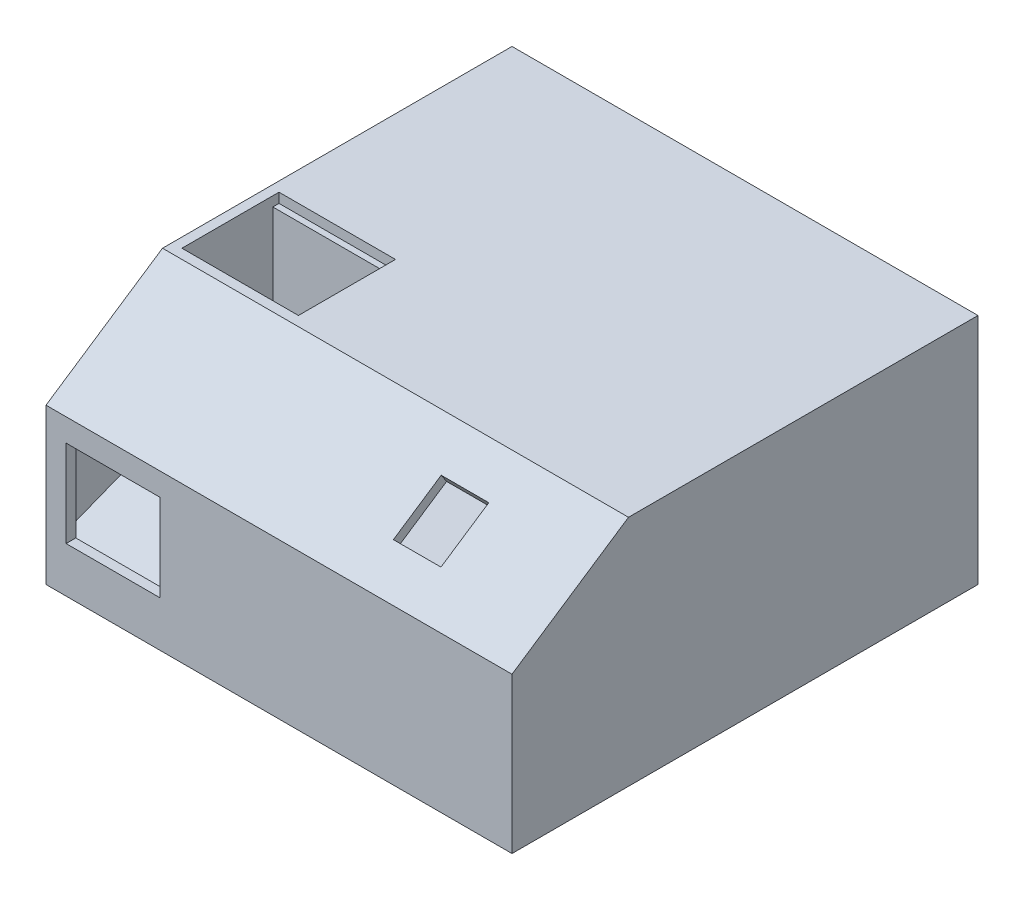
ISO-10303-21;
HEADER;
FILE_DESCRIPTION(('STEP AP214'),'2;1');
FILE_NAME('part.step','',(''),(''),'','','');
FILE_SCHEMA(('AUTOMOTIVE_DESIGN { 1 0 10303 214 1 1 1 1 }'));
ENDSEC;
DATA;
#1=APPLICATION_CONTEXT('core data for automotive mechanical design processes');
#2=APPLICATION_PROTOCOL_DEFINITION('international standard','automotive_design',2000,#1);
#3=PRODUCT_CONTEXT('',#1,'mechanical');
#4=PRODUCT('Part','Part','',(#3));
#5=PRODUCT_RELATED_PRODUCT_CATEGORY('part','',(#4));
#6=PRODUCT_DEFINITION_FORMATION('','',#4);
#7=PRODUCT_DEFINITION_CONTEXT('part definition',#1,'design');
#8=PRODUCT_DEFINITION('design','',#6,#7);
#9=PRODUCT_DEFINITION_SHAPE('','',#8);
#10=(LENGTH_UNIT() NAMED_UNIT(*) SI_UNIT(.MILLI.,.METRE.));
#11=(NAMED_UNIT(*) PLANE_ANGLE_UNIT() SI_UNIT($,.RADIAN.));
#12=(NAMED_UNIT(*) SI_UNIT($,.STERADIAN.) SOLID_ANGLE_UNIT());
#13=UNCERTAINTY_MEASURE_WITH_UNIT(LENGTH_MEASURE(1.E-05),#10,'distance_accuracy_value','');
#14=(GEOMETRIC_REPRESENTATION_CONTEXT(3) GLOBAL_UNCERTAINTY_ASSIGNED_CONTEXT((#13)) GLOBAL_UNIT_ASSIGNED_CONTEXT((#10,
#11,#12)) REPRESENTATION_CONTEXT('',''));
#15=CARTESIAN_POINT('',(0.,0.,0.));
#16=DIRECTION('',(0.,0.,1.));
#17=DIRECTION('',(1.,0.,0.));
#18=AXIS2_PLACEMENT_3D('',#15,#16,#17);
#19=CARTESIAN_POINT('',(-292.1,304.8,-304.8));
#20=DIRECTION('',(1.,0.,0.));
#21=DIRECTION('',(0.,0.,-1.));
#22=AXIS2_PLACEMENT_3D('',#19,#20,#21);
#23=PLANE('',#22);
#24=DIRECTION('',(0.,-1.,0.));
#25=VECTOR('',#24,1.);
#26=CARTESIAN_POINT('',(-292.1,304.8,292.1));
#27=LINE('',#26,#25);
#28=CARTESIAN_POINT('',(-292.1,196.403166267202,292.1));
#29=VERTEX_POINT('',#28);
#30=CARTESIAN_POINT('',(-292.1,59.5443169547873,292.1));
#31=VERTEX_POINT('',#30);
#32=EDGE_CURVE('E311',#29,#31,#27,.T.);
#33=ORIENTED_EDGE('',*,*,#32,.T.);
#34=DIRECTION('',(0.,-0.367891687131658,0.929868650154108));
#35=VECTOR('',#34,1.);
#36=CARTESIAN_POINT('',(-292.1,59.5443169547873,292.1));
#37=LINE('',#36,#35);
#38=CARTESIAN_POINT('',(-292.1,166.88227324806,20.7967767417733));
#39=VERTEX_POINT('',#38);
#40=EDGE_CURVE('E292',#39,#31,#37,.T.);
#41=ORIENTED_EDGE('',*,*,#40,.F.);
#42=DIRECTION('',(0.,-1.,0.));
#43=VECTOR('',#42,1.);
#44=CARTESIAN_POINT('',(-292.1,292.1,20.7967767417733));
#45=LINE('',#44,#43);
#46=CARTESIAN_POINT('',(-292.1,292.1,20.7967767417733));
#47=VERTEX_POINT('',#46);
#48=EDGE_CURVE('E346',#47,#39,#45,.T.);
#49=ORIENTED_EDGE('',*,*,#48,.F.);
#50=DIRECTION('',(0.,0.,-1.));
#51=VECTOR('',#50,1.);
#52=CARTESIAN_POINT('',(-292.1,292.1,148.554749400804));
#53=LINE('',#52,#51);
#54=CARTESIAN_POINT('',(-292.1,292.1,12.7));
#55=VERTEX_POINT('',#54);
#56=EDGE_CURVE('E352',#47,#55,#53,.T.);
#57=ORIENTED_EDGE('',*,*,#56,.T.);
#58=DIRECTION('',(0.,1.,0.));
#59=VECTOR('',#58,1.);
#60=CARTESIAN_POINT('',(-292.1,-0.000999999999973245,12.7));
#61=LINE('',#60,#59);
#62=CARTESIAN_POINT('',(-292.1,304.8,12.7));
#63=VERTEX_POINT('',#62);
#64=EDGE_CURVE('E380',#55,#63,#61,.T.);
#65=ORIENTED_EDGE('',*,*,#64,.T.);
#66=DIRECTION('',(0.,0.,1.));
#67=VECTOR('',#66,1.);
#68=CARTESIAN_POINT('',(-292.1,304.8,139.7));
#69=LINE('',#68,#67);
#70=CARTESIAN_POINT('',(-292.1,304.8,139.7));
#71=VERTEX_POINT('',#70);
#72=EDGE_CURVE('E381',#63,#71,#69,.T.);
#73=ORIENTED_EDGE('',*,*,#72,.T.);
#74=DIRECTION('',(0.,1.,0.));
#75=VECTOR('',#74,1.);
#76=CARTESIAN_POINT('',(-292.1,-0.000999999999973245,139.7));
#77=LINE('',#76,#75);
#78=CARTESIAN_POINT('',(-292.1,292.1,139.7));
#79=VERTEX_POINT('',#78);
#80=EDGE_CURVE('E400',#79,#71,#77,.T.);
#81=ORIENTED_EDGE('',*,*,#80,.F.);
#82=DIRECTION('',(0.,0.,1.));
#83=VECTOR('',#82,1.);
#84=CARTESIAN_POINT('',(-292.1,292.1,0.));
#85=LINE('',#84,#83);
#86=CARTESIAN_POINT('',(-292.1,292.1,148.554749400804));
#87=VERTEX_POINT('',#86);
#88=EDGE_CURVE('E323',#79,#87,#85,.T.);
#89=ORIENTED_EDGE('',*,*,#88,.T.);
#90=DIRECTION('',(0.,0.554700196225229,-0.832050294337844));
#91=VECTOR('',#90,1.);
#92=CARTESIAN_POINT('',(-292.1,192.632961261909,297.75530750794));
#93=LINE('',#92,#91);
#94=EDGE_CURVE('E319',#29,#87,#93,.T.);
#95=ORIENTED_EDGE('',*,*,#94,.F.);
#96=EDGE_LOOP('',(#33,#41,#49,#57,#65,#73,#81,#89,#95));
#97=FACE_BOUND('',#96,.T.);
#98=ADVANCED_FACE('F42',(#97),#23,.T.);
#99=CARTESIAN_POINT('',(-133.604,292.1,20.7967767417733));
#100=DIRECTION('',(0.,0.,-1.));
#101=DIRECTION('',(0.,1.,0.));
#102=AXIS2_PLACEMENT_3D('',#99,#100,#101);
#103=PLANE('',#102);
#104=DIRECTION('',(-1.,0.,0.));
#105=VECTOR('',#104,1.);
#106=CARTESIAN_POINT('',(304.802,166.88227324806,20.7967767417733));
#107=LINE('',#106,#105);
#108=CARTESIAN_POINT('',(-146.304,166.88227324806,20.7967767417733));
#109=VERTEX_POINT('',#108);
#110=EDGE_CURVE('E301',#109,#39,#107,.T.);
#111=ORIENTED_EDGE('',*,*,#110,.F.);
#112=DIRECTION('',(0.,-1.,0.));
#113=VECTOR('',#112,1.);
#114=CARTESIAN_POINT('',(-146.304,0.,20.7967767417733));
#115=LINE('',#114,#113);
#116=CARTESIAN_POINT('',(-146.304,292.1,20.7967767417733));
#117=VERTEX_POINT('',#116);
#118=EDGE_CURVE('E322',#117,#109,#115,.T.);
#119=ORIENTED_EDGE('',*,*,#118,.F.);
#120=DIRECTION('',(1.,0.,0.));
#121=VECTOR('',#120,1.);
#122=CARTESIAN_POINT('',(-133.604,292.1,20.7967767417733));
#123=LINE('',#122,#121);
#124=EDGE_CURVE('E349',#47,#117,#123,.T.);
#125=ORIENTED_EDGE('',*,*,#124,.F.);
#126=ORIENTED_EDGE('',*,*,#48,.T.);
#127=EDGE_LOOP('',(#111,#119,#125,#126));
#128=FACE_BOUND('',#127,.T.);
#129=ADVANCED_FACE('F546',(#128),#103,.F.);
#130=CARTESIAN_POINT('',(-146.304,0.,0.));
#131=DIRECTION('',(-1.,0.,0.));
#132=DIRECTION('',(0.,0.,1.));
#133=AXIS2_PLACEMENT_3D('',#130,#131,#132);
#134=PLANE('',#133);
#135=ORIENTED_EDGE('',*,*,#118,.T.);
#136=DIRECTION('',(0.,0.367891687131658,-0.929868650154108));
#137=VECTOR('',#136,1.);
#138=CARTESIAN_POINT('',(-146.304,59.5443169547873,292.1));
#139=LINE('',#138,#137);
#140=CARTESIAN_POINT('',(-146.303999999999,59.5443169547873,292.1));
#141=VERTEX_POINT('',#140);
#142=EDGE_CURVE('E289',#141,#109,#139,.T.);
#143=ORIENTED_EDGE('',*,*,#142,.F.);
#144=DIRECTION('',(0.,-1.,0.));
#145=VECTOR('',#144,1.);
#146=CARTESIAN_POINT('',(-146.304,0.,292.1));
#147=LINE('',#146,#145);
#148=CARTESIAN_POINT('',(-146.304,196.403166267202,292.1));
#149=VERTEX_POINT('',#148);
#150=EDGE_CURVE('E333',#149,#141,#147,.T.);
#151=ORIENTED_EDGE('',*,*,#150,.F.);
#152=DIRECTION('',(0.,0.554700196225229,-0.832050294337844));
#153=VECTOR('',#152,1.);
#154=CARTESIAN_POINT('',(-146.304,270.786807415756,180.52453827717));
#155=LINE('',#154,#153);
#156=CARTESIAN_POINT('',(-146.304,292.1,148.554749400804));
#157=VERTEX_POINT('',#156);
#158=EDGE_CURVE('E314',#149,#157,#155,.T.);
#159=ORIENTED_EDGE('',*,*,#158,.T.);
#160=DIRECTION('',(0.,0.,-1.));
#161=VECTOR('',#160,1.);
#162=CARTESIAN_POINT('',(-146.304,292.1,0.));
#163=LINE('',#162,#161);
#164=CARTESIAN_POINT('',(-146.304,292.1,139.7));
#165=VERTEX_POINT('',#164);
#166=EDGE_CURVE('E339',#157,#165,#163,.T.);
#167=ORIENTED_EDGE('',*,*,#166,.T.);
#168=EDGE_CURVE('E342',#165,#117,#163,.T.);
#169=ORIENTED_EDGE('',*,*,#168,.T.);
#170=EDGE_LOOP('',(#135,#143,#151,#159,#167,#169));
#171=FACE_BOUND('',#170,.T.);
#172=ADVANCED_FACE('F529',(#171),#134,.T.);
#173=CARTESIAN_POINT('',(-304.8,304.8,292.1));
#174=DIRECTION('',(0.,0.,-1.));
#175=DIRECTION('',(-1.,0.,0.));
#176=AXIS2_PLACEMENT_3D('',#173,#174,#175);
#177=PLANE('',#176);
#178=DIRECTION('',(0.,1.,0.));
#179=VECTOR('',#178,1.);
#180=CARTESIAN_POINT('',(-278.568540744124,59.5443169547873,292.1));
#181=LINE('',#180,#179);
#182=CARTESIAN_POINT('',(-278.568540744124,59.5443169547873,292.1));
#183=VERTEX_POINT('',#182);
#184=CARTESIAN_POINT('',(-278.568540744124,173.381452841056,292.1));
#185=VERTEX_POINT('',#184);
#186=EDGE_CURVE('E266',#183,#185,#181,.T.);
#187=ORIENTED_EDGE('',*,*,#186,.F.);
#188=DIRECTION('',(-1.,0.,0.));
#189=VECTOR('',#188,1.);
#190=CARTESIAN_POINT('',(304.802,59.5443169547873,292.1));
#191=LINE('',#190,#189);
#192=EDGE_CURVE('E300',#183,#31,#191,.T.);
#193=ORIENTED_EDGE('',*,*,#192,.T.);
#194=ORIENTED_EDGE('',*,*,#32,.F.);
#195=DIRECTION('',(-1.,0.,0.));
#196=VECTOR('',#195,1.);
#197=CARTESIAN_POINT('',(1447.8,196.403166267202,292.1));
#198=LINE('',#197,#196);
#199=EDGE_CURVE('E307',#149,#29,#198,.T.);
#200=ORIENTED_EDGE('',*,*,#199,.F.);
#201=ORIENTED_EDGE('',*,*,#150,.T.);
#202=CARTESIAN_POINT('',(-155.542107473219,59.5443169547873,292.1));
#203=VERTEX_POINT('',#202);
#204=EDGE_CURVE('E296',#141,#203,#191,.T.);
#205=ORIENTED_EDGE('',*,*,#204,.T.);
#206=DIRECTION('',(0.,-1.,0.));
#207=VECTOR('',#206,1.);
#208=CARTESIAN_POINT('',(-155.542107473219,59.5443169547873,292.1));
#209=LINE('',#208,#207);
#210=CARTESIAN_POINT('',(-155.542107473219,173.381452841056,292.1));
#211=VERTEX_POINT('',#210);
#212=EDGE_CURVE('E278',#211,#203,#209,.T.);
#213=ORIENTED_EDGE('',*,*,#212,.F.);
#214=DIRECTION('',(1.,0.,0.));
#215=VECTOR('',#214,1.);
#216=CARTESIAN_POINT('',(-278.568540744124,173.381452841056,292.1));
#217=LINE('',#216,#215);
#218=EDGE_CURVE('E58',#185,#211,#217,.T.);
#219=ORIENTED_EDGE('',*,*,#218,.F.);
#220=EDGE_LOOP('',(#187,#193,#194,#200,#201,#205,#213,#219));
#221=FACE_BOUND('',#220,.T.);
#222=ADVANCED_FACE('F275',(#221),#177,.T.);
#223=CARTESIAN_POINT('',(-133.604,292.1,148.554749400804));
#224=DIRECTION('',(0.,1.,0.));
#225=DIRECTION('',(0.,0.,1.));
#226=AXIS2_PLACEMENT_3D('',#223,#224,#225);
#227=PLANE('',#226);
#228=ORIENTED_EDGE('',*,*,#56,.F.);
#229=ORIENTED_EDGE('',*,*,#124,.T.);
#230=ORIENTED_EDGE('',*,*,#168,.F.);
#231=DIRECTION('',(1.,0.,0.));
#232=VECTOR('',#231,1.);
#233=CARTESIAN_POINT('',(-292.1,292.1,139.7));
#234=LINE('',#233,#232);
#235=CARTESIAN_POINT('',(-139.7,292.1,139.7));
#236=VERTEX_POINT('',#235);
#237=EDGE_CURVE('E374',#165,#236,#234,.T.);
#238=ORIENTED_EDGE('',*,*,#237,.T.);
#239=DIRECTION('',(0.,0.,-1.));
#240=VECTOR('',#239,1.);
#241=CARTESIAN_POINT('',(-139.7,292.1,139.7));
#242=LINE('',#241,#240);
#243=CARTESIAN_POINT('',(-139.7,292.1,12.7));
#244=VERTEX_POINT('',#243);
#245=EDGE_CURVE('E376',#236,#244,#242,.T.);
#246=ORIENTED_EDGE('',*,*,#245,.T.);
#247=DIRECTION('',(-1.,0.,0.));
#248=VECTOR('',#247,1.);
#249=CARTESIAN_POINT('',(-292.1,292.1,12.7));
#250=LINE('',#249,#248);
#251=EDGE_CURVE('E397',#244,#55,#250,.T.);
#252=ORIENTED_EDGE('',*,*,#251,.T.);
#253=EDGE_LOOP('',(#228,#229,#230,#238,#246,#252));
#254=FACE_BOUND('',#253,.T.);
#255=ADVANCED_FACE('F548',(#254),#227,.T.);
#256=CARTESIAN_POINT('',(-304.8,304.8,292.1));
#257=DIRECTION('',(0.,0.,-1.));
#258=DIRECTION('',(-1.,0.,0.));
#259=AXIS2_PLACEMENT_3D('',#256,#257,#258);
#260=PLANE('',#259);
#261=DIRECTION('',(1.,0.,0.));
#262=VECTOR('',#261,1.);
#263=CARTESIAN_POINT('',(0.,12.7,292.1));
#264=LINE('',#263,#262);
#265=CARTESIAN_POINT('',(-133.604,12.7,292.1));
#266=VERTEX_POINT('',#265);
#267=CARTESIAN_POINT('',(292.1,12.7,292.1));
#268=VERTEX_POINT('',#267);
#269=EDGE_CURVE('E440',#266,#268,#264,.T.);
#270=ORIENTED_EDGE('',*,*,#269,.F.);
#271=DIRECTION('',(0.,-1.,0.));
#272=VECTOR('',#271,1.);
#273=CARTESIAN_POINT('',(-133.604,196.403166267202,292.1));
#274=LINE('',#273,#272);
#275=CARTESIAN_POINT('',(-133.604,196.403166267202,292.1));
#276=VERTEX_POINT('',#275);
#277=EDGE_CURVE('E362',#276,#266,#274,.T.);
#278=ORIENTED_EDGE('',*,*,#277,.F.);
#279=DIRECTION('',(-1.,0.,0.));
#280=VECTOR('',#279,1.);
#281=CARTESIAN_POINT('',(1447.8,196.403166267202,292.1));
#282=LINE('',#281,#280);
#283=CARTESIAN_POINT('',(292.1,196.403166267202,292.1));
#284=VERTEX_POINT('',#283);
#285=EDGE_CURVE('E437',#284,#276,#282,.T.);
#286=ORIENTED_EDGE('',*,*,#285,.F.);
#287=DIRECTION('',(0.,-1.,0.));
#288=VECTOR('',#287,1.);
#289=CARTESIAN_POINT('',(292.1,304.8,292.1));
#290=LINE('',#289,#288);
#291=EDGE_CURVE('E443',#284,#268,#290,.T.);
#292=ORIENTED_EDGE('',*,*,#291,.T.);
#293=EDGE_LOOP('',(#270,#278,#286,#292));
#294=FACE_BOUND('',#293,.T.);
#295=ADVANCED_FACE('F630',(#294),#260,.T.);
#296=CARTESIAN_POINT('',(1447.8,192.632961261909,297.75530750794));
#297=DIRECTION('',(0.,0.832050294337844,0.554700196225229));
#298=DIRECTION('',(0.,-0.554700196225229,0.832050294337844));
#299=AXIS2_PLACEMENT_3D('',#296,#297,#298);
#300=PLANE('',#299);
#301=DIRECTION('',(0.,0.554700196225229,-0.832050294337844));
#302=VECTOR('',#301,1.);
#303=CARTESIAN_POINT('',(104.732083822483,264.285251038408,190.276872843191));
#304=LINE('',#303,#302);
#305=CARTESIAN_POINT('',(104.732083822483,222.580671485411,252.833742172688));
#306=VERTEX_POINT('',#305);
#307=CARTESIAN_POINT('',(104.732083822483,264.285251038408,190.276872843191));
#308=VERTEX_POINT('',#307);
#309=EDGE_CURVE('E407',#306,#308,#304,.T.);
#310=ORIENTED_EDGE('',*,*,#309,.F.);
#311=DIRECTION('',(-1.,0.,0.));
#312=VECTOR('',#311,1.);
#313=CARTESIAN_POINT('',(104.732083822483,222.580671485411,252.833742172688));
#314=LINE('',#313,#312);
#315=CARTESIAN_POINT('',(166.962083822483,222.580671485411,252.833742172688));
#316=VERTEX_POINT('',#315);
#317=EDGE_CURVE('E384',#316,#306,#314,.T.);
#318=ORIENTED_EDGE('',*,*,#317,.F.);
#319=DIRECTION('',(0.,-0.554700196225229,0.832050294337844));
#320=VECTOR('',#319,1.);
#321=CARTESIAN_POINT('',(166.962083822483,264.285251038408,190.276872843191));
#322=LINE('',#321,#320);
#323=CARTESIAN_POINT('',(166.962083822483,264.285251038408,190.276872843191));
#324=VERTEX_POINT('',#323);
#325=EDGE_CURVE('E420',#324,#316,#322,.T.);
#326=ORIENTED_EDGE('',*,*,#325,.F.);
#327=DIRECTION('',(1.,0.,0.));
#328=VECTOR('',#327,1.);
#329=CARTESIAN_POINT('',(104.732083822483,264.285251038408,190.276872843191));
#330=LINE('',#329,#328);
#331=EDGE_CURVE('E423',#308,#324,#330,.T.);
#332=ORIENTED_EDGE('',*,*,#331,.F.);
#333=EDGE_LOOP('',(#310,#318,#326,#332));
#334=FACE_BOUND('',#333,.T.);
#335=DIRECTION('',(0.,-0.554700196225229,0.832050294337843));
#336=VECTOR('',#335,1.);
#337=CARTESIAN_POINT('',(-133.604,292.1,148.554749400804));
#338=LINE('',#337,#336);
#339=CARTESIAN_POINT('',(-133.604,292.1,148.554749400804));
#340=VERTEX_POINT('',#339);
#341=EDGE_CURVE('E365',#340,#276,#338,.T.);
#342=ORIENTED_EDGE('',*,*,#341,.F.);
#343=DIRECTION('',(-1.,0.,0.));
#344=VECTOR('',#343,1.);
#345=CARTESIAN_POINT('',(0.,292.1,148.554749400804));
#346=LINE('',#345,#344);
#347=CARTESIAN_POINT('',(292.1,292.1,148.554749400804));
#348=VERTEX_POINT('',#347);
#349=EDGE_CURVE('E436',#348,#340,#346,.T.);
#350=ORIENTED_EDGE('',*,*,#349,.F.);
#351=DIRECTION('',(0.,0.554700196225229,-0.832050294337844));
#352=VECTOR('',#351,1.);
#353=CARTESIAN_POINT('',(292.1,192.632961261909,297.75530750794));
#354=LINE('',#353,#352);
#355=EDGE_CURVE('E439',#284,#348,#354,.T.);
#356=ORIENTED_EDGE('',*,*,#355,.F.);
#357=ORIENTED_EDGE('',*,*,#285,.T.);
#358=EDGE_LOOP('',(#342,#350,#356,#357));
#359=FACE_BOUND('',#358,.T.);
#360=ADVANCED_FACE('F635',(#334,#359),#300,.F.);
#361=CARTESIAN_POINT('',(-304.8,304.8,-304.8));
#362=DIRECTION('',(0.,0.,-1.));
#363=DIRECTION('',(-1.,0.,0.));
#364=AXIS2_PLACEMENT_3D('',#361,#362,#363);
#365=PLANE('',#364);
#366=DIRECTION('',(1.,0.,0.));
#367=VECTOR('',#366,1.);
#368=CARTESIAN_POINT('',(-304.8,0.,-304.8));
#369=LINE('',#368,#367);
#370=CARTESIAN_POINT('',(-304.8,0.,-304.8));
#371=VERTEX_POINT('',#370);
#372=CARTESIAN_POINT('',(304.8,0.,-304.8));
#373=VERTEX_POINT('',#372);
#374=EDGE_CURVE('E498',#371,#373,#369,.T.);
#375=ORIENTED_EDGE('',*,*,#374,.F.);
#376=DIRECTION('',(0.,-1.,0.));
#377=VECTOR('',#376,1.);
#378=CARTESIAN_POINT('',(-304.8,304.8,-304.8));
#379=LINE('',#378,#377);
#380=CARTESIAN_POINT('',(-304.8,304.8,-304.8));
#381=VERTEX_POINT('',#380);
#382=EDGE_CURVE('E504',#381,#371,#379,.T.);
#383=ORIENTED_EDGE('',*,*,#382,.F.);
#384=DIRECTION('',(1.,0.,0.));
#385=VECTOR('',#384,1.);
#386=CARTESIAN_POINT('',(-304.8,304.8,-304.8));
#387=LINE('',#386,#385);
#388=CARTESIAN_POINT('',(304.8,304.8,-304.8));
#389=VERTEX_POINT('',#388);
#390=EDGE_CURVE('E486',#381,#389,#387,.T.);
#391=ORIENTED_EDGE('',*,*,#390,.T.);
#392=DIRECTION('',(0.,-1.,0.));
#393=VECTOR('',#392,1.);
#394=CARTESIAN_POINT('',(304.8,304.8,-304.8));
#395=LINE('',#394,#393);
#396=EDGE_CURVE('E506',#389,#373,#395,.T.);
#397=ORIENTED_EDGE('',*,*,#396,.T.);
#398=EDGE_LOOP('',(#375,#383,#391,#397));
#399=FACE_BOUND('',#398,.T.);
#400=DIRECTION('',(0.,-1.,0.));
#401=VECTOR('',#400,1.);
#402=CARTESIAN_POINT('',(-292.1,304.8,-304.8));
#403=LINE('',#402,#401);
#404=CARTESIAN_POINT('',(-292.1,292.1,-304.8));
#405=VERTEX_POINT('',#404);
#406=CARTESIAN_POINT('',(-292.1,12.7,-304.8));
#407=VERTEX_POINT('',#406);
#408=EDGE_CURVE('E463',#405,#407,#403,.T.);
#409=ORIENTED_EDGE('',*,*,#408,.T.);
#410=DIRECTION('',(1.,0.,0.));
#411=VECTOR('',#410,1.);
#412=CARTESIAN_POINT('',(0.,12.7,-304.8));
#413=LINE('',#412,#411);
#414=CARTESIAN_POINT('',(292.1,12.7,-304.8));
#415=VERTEX_POINT('',#414);
#416=EDGE_CURVE('E457',#407,#415,#413,.T.);
#417=ORIENTED_EDGE('',*,*,#416,.T.);
#418=DIRECTION('',(0.,-1.,0.));
#419=VECTOR('',#418,1.);
#420=CARTESIAN_POINT('',(292.1,304.8,-304.8));
#421=LINE('',#420,#419);
#422=CARTESIAN_POINT('',(292.1,292.1,-304.8));
#423=VERTEX_POINT('',#422);
#424=EDGE_CURVE('E447',#423,#415,#421,.T.);
#425=ORIENTED_EDGE('',*,*,#424,.F.);
#426=DIRECTION('',(1.,0.,0.));
#427=VECTOR('',#426,1.);
#428=CARTESIAN_POINT('',(0.,292.1,-304.8));
#429=LINE('',#428,#427);
#430=EDGE_CURVE('E451',#405,#423,#429,.T.);
#431=ORIENTED_EDGE('',*,*,#430,.F.);
#432=EDGE_LOOP('',(#409,#417,#425,#431));
#433=FACE_BOUND('',#432,.T.);
#434=ADVANCED_FACE('F752',(#399,#433),#365,.T.);
#435=CARTESIAN_POINT('',(-304.8,304.8,304.8));
#436=DIRECTION('',(0.,0.,-1.));
#437=DIRECTION('',(-1.,0.,0.));
#438=AXIS2_PLACEMENT_3D('',#435,#436,#437);
#439=PLANE('',#438);
#440=DIRECTION('',(-1.,0.,0.));
#441=VECTOR('',#440,1.);
#442=CARTESIAN_POINT('',(-304.8,59.5443169547873,304.8));
#443=LINE('',#442,#441);
#444=CARTESIAN_POINT('',(-155.542107473219,59.5443169547873,304.8));
#445=VERTEX_POINT('',#444);
#446=CARTESIAN_POINT('',(-278.568540744124,59.5443169547873,304.8));
#447=VERTEX_POINT('',#446);
#448=EDGE_CURVE('E51',#445,#447,#443,.T.);
#449=ORIENTED_EDGE('',*,*,#448,.T.);
#450=DIRECTION('',(0.,1.,0.));
#451=VECTOR('',#450,1.);
#452=CARTESIAN_POINT('',(-278.568540744124,304.8,304.8));
#453=LINE('',#452,#451);
#454=CARTESIAN_POINT('',(-278.568540744124,173.381452841056,304.8));
#455=VERTEX_POINT('',#454);
#456=EDGE_CURVE('E11',#447,#455,#453,.T.);
#457=ORIENTED_EDGE('',*,*,#456,.T.);
#458=DIRECTION('',(1.,0.,0.));
#459=VECTOR('',#458,1.);
#460=CARTESIAN_POINT('',(-304.8,173.381452841056,304.8));
#461=LINE('',#460,#459);
#462=CARTESIAN_POINT('',(-155.542107473219,173.381452841056,304.8));
#463=VERTEX_POINT('',#462);
#464=EDGE_CURVE('E261',#455,#463,#461,.T.);
#465=ORIENTED_EDGE('',*,*,#464,.T.);
#466=DIRECTION('',(0.,-1.,0.));
#467=VECTOR('',#466,1.);
#468=CARTESIAN_POINT('',(-155.542107473219,304.8,304.8));
#469=LINE('',#468,#467);
#470=EDGE_CURVE('E511',#463,#445,#469,.T.);
#471=ORIENTED_EDGE('',*,*,#470,.T.);
#472=EDGE_LOOP('',(#449,#457,#465,#471));
#473=FACE_BOUND('',#472,.T.);
#474=DIRECTION('',(-1.,0.,0.));
#475=VECTOR('',#474,1.);
#476=CARTESIAN_POINT('',(1447.8,203.2,304.8));
#477=LINE('',#476,#475);
#478=CARTESIAN_POINT('',(304.8,203.2,304.8));
#479=VERTEX_POINT('',#478);
#480=CARTESIAN_POINT('',(-304.8,203.2,304.8));
#481=VERTEX_POINT('',#480);
#482=EDGE_CURVE('E477',#479,#481,#477,.T.);
#483=ORIENTED_EDGE('',*,*,#482,.T.);
#484=DIRECTION('',(0.,-1.,0.));
#485=VECTOR('',#484,1.);
#486=CARTESIAN_POINT('',(-304.8,304.8,304.8));
#487=LINE('',#486,#485);
#488=CARTESIAN_POINT('',(-304.8,0.,304.8));
#489=VERTEX_POINT('',#488);
#490=EDGE_CURVE('E492',#481,#489,#487,.T.);
#491=ORIENTED_EDGE('',*,*,#490,.T.);
#492=DIRECTION('',(1.,0.,0.));
#493=VECTOR('',#492,1.);
#494=CARTESIAN_POINT('',(-304.8,0.,304.8));
#495=LINE('',#494,#493);
#496=CARTESIAN_POINT('',(304.8,0.,304.8));
#497=VERTEX_POINT('',#496);
#498=EDGE_CURVE('E482',#489,#497,#495,.T.);
#499=ORIENTED_EDGE('',*,*,#498,.T.);
#500=DIRECTION('',(0.,-1.,0.));
#501=VECTOR('',#500,1.);
#502=CARTESIAN_POINT('',(304.8,304.8,304.8));
#503=LINE('',#502,#501);
#504=EDGE_CURVE('E508',#479,#497,#503,.T.);
#505=ORIENTED_EDGE('',*,*,#504,.F.);
#506=EDGE_LOOP('',(#483,#491,#499,#505));
#507=FACE_BOUND('',#506,.T.);
#508=ADVANCED_FACE('F44',(#473,#507),#439,.F.);
#509=CARTESIAN_POINT('',(304.8,304.8,-304.8));
#510=DIRECTION('',(1.,0.,0.));
#511=DIRECTION('',(0.,0.,-1.));
#512=AXIS2_PLACEMENT_3D('',#509,#510,#511);
#513=PLANE('',#512);
#514=DIRECTION('',(0.,0.,1.));
#515=VECTOR('',#514,1.);
#516=CARTESIAN_POINT('',(304.8,304.8,-304.8));
#517=LINE('',#516,#515);
#518=CARTESIAN_POINT('',(304.8,304.8,152.4));
#519=VERTEX_POINT('',#518);
#520=EDGE_CURVE('E483',#389,#519,#517,.T.);
#521=ORIENTED_EDGE('',*,*,#520,.T.);
#522=DIRECTION('',(0.,0.554700196225229,-0.832050294337844));
#523=VECTOR('',#522,1.);
#524=CARTESIAN_POINT('',(304.8,203.2,304.8));
#525=LINE('',#524,#523);
#526=EDGE_CURVE('E479',#479,#519,#525,.T.);
#527=ORIENTED_EDGE('',*,*,#526,.F.);
#528=ORIENTED_EDGE('',*,*,#504,.T.);
#529=DIRECTION('',(0.,0.,1.));
#530=VECTOR('',#529,1.);
#531=CARTESIAN_POINT('',(304.8,0.,-304.8));
#532=LINE('',#531,#530);
#533=EDGE_CURVE('E495',#373,#497,#532,.T.);
#534=ORIENTED_EDGE('',*,*,#533,.F.);
#535=ORIENTED_EDGE('',*,*,#396,.F.);
#536=EDGE_LOOP('',(#521,#527,#528,#534,#535));
#537=FACE_BOUND('',#536,.T.);
#538=ADVANCED_FACE('F751',(#537),#513,.T.);
#539=CARTESIAN_POINT('',(0.,304.8,0.));
#540=DIRECTION('',(0.,-1.,0.));
#541=DIRECTION('',(0.,0.,-1.));
#542=AXIS2_PLACEMENT_3D('',#539,#540,#541);
#543=PLANE('',#542);
#544=DIRECTION('',(0.,0.,-1.));
#545=VECTOR('',#544,1.);
#546=CARTESIAN_POINT('',(-139.7,304.8,139.7));
#547=LINE('',#546,#545);
#548=CARTESIAN_POINT('',(-139.7,304.8,139.7));
#549=VERTEX_POINT('',#548);
#550=CARTESIAN_POINT('',(-139.7,304.8,12.7));
#551=VERTEX_POINT('',#550);
#552=EDGE_CURVE('E388',#549,#551,#547,.T.);
#553=ORIENTED_EDGE('',*,*,#552,.F.);
#554=DIRECTION('',(1.,0.,0.));
#555=VECTOR('',#554,1.);
#556=CARTESIAN_POINT('',(-292.1,304.8,139.7));
#557=LINE('',#556,#555);
#558=EDGE_CURVE('E391',#71,#549,#557,.T.);
#559=ORIENTED_EDGE('',*,*,#558,.F.);
#560=ORIENTED_EDGE('',*,*,#72,.F.);
#561=DIRECTION('',(-1.,0.,0.));
#562=VECTOR('',#561,1.);
#563=CARTESIAN_POINT('',(-292.1,304.8,12.7));
#564=LINE('',#563,#562);
#565=EDGE_CURVE('E385',#551,#63,#564,.T.);
#566=ORIENTED_EDGE('',*,*,#565,.F.);
#567=EDGE_LOOP('',(#553,#559,#560,#566));
#568=FACE_BOUND('',#567,.T.);
#569=DIRECTION('',(-1.,0.,0.));
#570=VECTOR('',#569,1.);
#571=CARTESIAN_POINT('',(1447.8,304.8,152.4));
#572=LINE('',#571,#570);
#573=CARTESIAN_POINT('',(-304.8,304.8,152.4));
#574=VERTEX_POINT('',#573);
#575=EDGE_CURVE('E474',#519,#574,#572,.T.);
#576=ORIENTED_EDGE('',*,*,#575,.F.);
#577=ORIENTED_EDGE('',*,*,#520,.F.);
#578=ORIENTED_EDGE('',*,*,#390,.F.);
#579=DIRECTION('',(0.,0.,1.));
#580=VECTOR('',#579,1.);
#581=CARTESIAN_POINT('',(-304.8,304.8,-304.8));
#582=LINE('',#581,#580);
#583=EDGE_CURVE('E490',#381,#574,#582,.T.);
#584=ORIENTED_EDGE('',*,*,#583,.T.);
#585=EDGE_LOOP('',(#576,#577,#578,#584));
#586=FACE_BOUND('',#585,.T.);
#587=ADVANCED_FACE('F560',(#568,#586),#543,.F.);
#588=CARTESIAN_POINT('',(-304.8,304.8,-304.8));
#589=DIRECTION('',(1.,0.,0.));
#590=DIRECTION('',(0.,0.,-1.));
#591=AXIS2_PLACEMENT_3D('',#588,#589,#590);
#592=PLANE('',#591);
#593=ORIENTED_EDGE('',*,*,#490,.F.);
#594=DIRECTION('',(0.,0.554700196225229,-0.832050294337844));
#595=VECTOR('',#594,1.);
#596=CARTESIAN_POINT('',(-304.8,203.2,304.8));
#597=LINE('',#596,#595);
#598=EDGE_CURVE('E446',#481,#574,#597,.T.);
#599=ORIENTED_EDGE('',*,*,#598,.T.);
#600=ORIENTED_EDGE('',*,*,#583,.F.);
#601=ORIENTED_EDGE('',*,*,#382,.T.);
#602=DIRECTION('',(0.,0.,1.));
#603=VECTOR('',#602,1.);
#604=CARTESIAN_POINT('',(-304.8,0.,-304.8));
#605=LINE('',#604,#603);
#606=EDGE_CURVE('E487',#371,#489,#605,.T.);
#607=ORIENTED_EDGE('',*,*,#606,.T.);
#608=EDGE_LOOP('',(#593,#599,#600,#601,#607));
#609=FACE_BOUND('',#608,.T.);
#610=ADVANCED_FACE('F774',(#609),#592,.F.);
#611=CARTESIAN_POINT('',(0.,0.,0.));
#612=DIRECTION('',(0.,-1.,0.));
#613=DIRECTION('',(0.,0.,-1.));
#614=AXIS2_PLACEMENT_3D('',#611,#612,#613);
#615=PLANE('',#614);
#616=ORIENTED_EDGE('',*,*,#498,.F.);
#617=ORIENTED_EDGE('',*,*,#606,.F.);
#618=ORIENTED_EDGE('',*,*,#374,.T.);
#619=ORIENTED_EDGE('',*,*,#533,.T.);
#620=EDGE_LOOP('',(#616,#617,#618,#619));
#621=FACE_BOUND('',#620,.T.);
#622=ADVANCED_FACE('F783',(#621),#615,.T.);
#623=CARTESIAN_POINT('',(1447.8,203.2,304.8));
#624=DIRECTION('',(0.,0.832050294337844,0.554700196225229));
#625=DIRECTION('',(0.,-0.554700196225229,0.832050294337844));
#626=AXIS2_PLACEMENT_3D('',#623,#624,#625);
#627=PLANE('',#626);
#628=DIRECTION('',(1.,0.,0.));
#629=VECTOR('',#628,1.);
#630=CARTESIAN_POINT('',(104.732083822483,233.147710223501,259.878434664748));
#631=LINE('',#630,#629);
#632=CARTESIAN_POINT('',(104.732083822483,233.147710223501,259.878434664748));
#633=VERTEX_POINT('',#632);
#634=CARTESIAN_POINT('',(166.962083822483,233.147710223501,259.878434664748));
#635=VERTEX_POINT('',#634);
#636=EDGE_CURVE('E414',#633,#635,#631,.T.);
#637=ORIENTED_EDGE('',*,*,#636,.F.);
#638=DIRECTION('',(0.,-0.554700196225229,0.832050294337844));
#639=VECTOR('',#638,1.);
#640=CARTESIAN_POINT('',(104.732083822483,274.852289776499,197.321565335252));
#641=LINE('',#640,#639);
#642=CARTESIAN_POINT('',(104.732083822483,274.852289776499,197.321565335252));
#643=VERTEX_POINT('',#642);
#644=EDGE_CURVE('E417',#643,#633,#641,.T.);
#645=ORIENTED_EDGE('',*,*,#644,.F.);
#646=DIRECTION('',(-1.,0.,0.));
#647=VECTOR('',#646,1.);
#648=CARTESIAN_POINT('',(104.732083822483,274.852289776499,197.321565335252));
#649=LINE('',#648,#647);
#650=CARTESIAN_POINT('',(166.962083822483,274.852289776499,197.321565335252));
#651=VERTEX_POINT('',#650);
#652=EDGE_CURVE('E408',#651,#643,#649,.T.);
#653=ORIENTED_EDGE('',*,*,#652,.F.);
#654=DIRECTION('',(0.,0.554700196225229,-0.832050294337843));
#655=VECTOR('',#654,1.);
#656=CARTESIAN_POINT('',(166.962083822483,274.852289776499,197.321565335252));
#657=LINE('',#656,#655);
#658=EDGE_CURVE('E411',#635,#651,#657,.T.);
#659=ORIENTED_EDGE('',*,*,#658,.F.);
#660=EDGE_LOOP('',(#637,#645,#653,#659));
#661=FACE_BOUND('',#660,.T.);
#662=ORIENTED_EDGE('',*,*,#482,.F.);
#663=ORIENTED_EDGE('',*,*,#526,.T.);
#664=ORIENTED_EDGE('',*,*,#575,.T.);
#665=ORIENTED_EDGE('',*,*,#598,.F.);
#666=EDGE_LOOP('',(#662,#663,#664,#665));
#667=FACE_BOUND('',#666,.T.);
#668=ADVANCED_FACE('F790',(#661,#667),#627,.T.);
#669=CARTESIAN_POINT('',(292.1,304.8,-304.8));
#670=DIRECTION('',(1.,0.,0.));
#671=DIRECTION('',(0.,0.,-1.));
#672=AXIS2_PLACEMENT_3D('',#669,#670,#671);
#673=PLANE('',#672);
#674=DIRECTION('',(0.,0.,1.));
#675=VECTOR('',#674,1.);
#676=CARTESIAN_POINT('',(292.1,292.1,0.));
#677=LINE('',#676,#675);
#678=EDGE_CURVE('E448',#423,#348,#677,.T.);
#679=ORIENTED_EDGE('',*,*,#678,.F.);
#680=ORIENTED_EDGE('',*,*,#424,.T.);
#681=DIRECTION('',(0.,0.,1.));
#682=VECTOR('',#681,1.);
#683=CARTESIAN_POINT('',(292.1,12.7,0.));
#684=LINE('',#683,#682);
#685=EDGE_CURVE('E442',#415,#268,#684,.T.);
#686=ORIENTED_EDGE('',*,*,#685,.T.);
#687=ORIENTED_EDGE('',*,*,#291,.F.);
#688=ORIENTED_EDGE('',*,*,#355,.T.);
#689=EDGE_LOOP('',(#679,#680,#686,#687,#688));
#690=FACE_BOUND('',#689,.T.);
#691=ADVANCED_FACE('F797',(#690),#673,.F.);
#692=CARTESIAN_POINT('',(0.,292.1,0.));
#693=DIRECTION('',(0.,-1.,0.));
#694=DIRECTION('',(0.,0.,-1.));
#695=AXIS2_PLACEMENT_3D('',#692,#693,#694);
#696=PLANE('',#695);
#697=DIRECTION('',(-1.,0.,0.));
#698=VECTOR('',#697,1.);
#699=CARTESIAN_POINT('',(-133.604,292.1,8.09677674177331));
#700=LINE('',#699,#698);
#701=CARTESIAN_POINT('',(-133.604,292.1,8.09677674177327));
#702=VERTEX_POINT('',#701);
#703=CARTESIAN_POINT('',(-292.1,292.1,8.09677674177326));
#704=VERTEX_POINT('',#703);
#705=EDGE_CURVE('E368',#702,#704,#700,.T.);
#706=ORIENTED_EDGE('',*,*,#705,.T.);
#707=DIRECTION('',(0.,0.,1.));
#708=VECTOR('',#707,1.);
#709=CARTESIAN_POINT('',(-292.1,292.1,0.));
#710=LINE('',#709,#708);
#711=EDGE_CURVE('E460',#405,#704,#710,.T.);
#712=ORIENTED_EDGE('',*,*,#711,.F.);
#713=ORIENTED_EDGE('',*,*,#430,.T.);
#714=ORIENTED_EDGE('',*,*,#678,.T.);
#715=ORIENTED_EDGE('',*,*,#349,.T.);
#716=DIRECTION('',(0.,0.,-1.));
#717=VECTOR('',#716,1.);
#718=CARTESIAN_POINT('',(-133.604,292.1,148.554749400804));
#719=LINE('',#718,#717);
#720=EDGE_CURVE('E353',#340,#702,#719,.T.);
#721=ORIENTED_EDGE('',*,*,#720,.T.);
#722=EDGE_LOOP('',(#706,#712,#713,#714,#715,#721));
#723=FACE_BOUND('',#722,.T.);
#724=ADVANCED_FACE('F594',(#723),#696,.T.);
#725=DIRECTION('',(0.,-1.,0.));
#726=VECTOR('',#725,1.);
#727=CARTESIAN_POINT('',(-292.1,292.1,8.09677674177331));
#728=LINE('',#727,#726);
#729=CARTESIAN_POINT('',(-292.1,12.7,8.09677674177327));
#730=VERTEX_POINT('',#729);
#731=EDGE_CURVE('E356',#704,#730,#728,.T.);
#732=ORIENTED_EDGE('',*,*,#731,.T.);
#733=DIRECTION('',(0.,0.,1.));
#734=VECTOR('',#733,1.);
#735=CARTESIAN_POINT('',(-292.1,12.7,0.));
#736=LINE('',#735,#734);
#737=EDGE_CURVE('E452',#407,#730,#736,.T.);
#738=ORIENTED_EDGE('',*,*,#737,.F.);
#739=ORIENTED_EDGE('',*,*,#408,.F.);
#740=ORIENTED_EDGE('',*,*,#711,.T.);
#741=EDGE_LOOP('',(#732,#738,#739,#740));
#742=FACE_BOUND('',#741,.T.);
#743=ADVANCED_FACE('F582',(#742),#23,.T.);
#744=CARTESIAN_POINT('',(0.,12.7,0.));
#745=DIRECTION('',(0.,-1.,0.));
#746=DIRECTION('',(0.,0.,-1.));
#747=AXIS2_PLACEMENT_3D('',#744,#745,#746);
#748=PLANE('',#747);
#749=ORIENTED_EDGE('',*,*,#737,.T.);
#750=DIRECTION('',(-1.,0.,0.));
#751=VECTOR('',#750,1.);
#752=CARTESIAN_POINT('',(-133.604,12.7,8.09677674177327));
#753=LINE('',#752,#751);
#754=CARTESIAN_POINT('',(-133.604,12.7,8.09677674177327));
#755=VERTEX_POINT('',#754);
#756=EDGE_CURVE('E371',#755,#730,#753,.T.);
#757=ORIENTED_EDGE('',*,*,#756,.F.);
#758=DIRECTION('',(0.,0.,-1.));
#759=VECTOR('',#758,1.);
#760=CARTESIAN_POINT('',(-133.604,12.7,292.1));
#761=LINE('',#760,#759);
#762=EDGE_CURVE('E359',#266,#755,#761,.T.);
#763=ORIENTED_EDGE('',*,*,#762,.F.);
#764=ORIENTED_EDGE('',*,*,#269,.T.);
#765=ORIENTED_EDGE('',*,*,#685,.F.);
#766=ORIENTED_EDGE('',*,*,#416,.F.);
#767=EDGE_LOOP('',(#749,#757,#763,#764,#765,#766));
#768=FACE_BOUND('',#767,.T.);
#769=ADVANCED_FACE('F593',(#768),#748,.F.);
#770=CARTESIAN_POINT('',(104.732083822483,-188.884212853422,-21.4761807198673));
#771=DIRECTION('',(0.,-0.554700196225229,0.832050294337843));
#772=DIRECTION('',(0.,-0.832050294337844,-0.554700196225229));
#773=AXIS2_PLACEMENT_3D('',#770,#771,#772);
#774=PLANE('',#773);
#775=ORIENTED_EDGE('',*,*,#317,.T.);
#776=DIRECTION('',(0.,0.832050294337843,0.554700196225229));
#777=VECTOR('',#776,1.);
#778=CARTESIAN_POINT('',(104.732083822483,-188.884212853422,-21.4761807198673));
#779=LINE('',#778,#777);
#780=EDGE_CURVE('E431',#306,#633,#779,.T.);
#781=ORIENTED_EDGE('',*,*,#780,.T.);
#782=ORIENTED_EDGE('',*,*,#636,.T.);
#783=DIRECTION('',(0.,0.832050294337843,0.554700196225229));
#784=VECTOR('',#783,1.);
#785=CARTESIAN_POINT('',(166.962083822483,-188.884212853422,-21.4761807198673));
#786=LINE('',#785,#784);
#787=EDGE_CURVE('E410',#316,#635,#786,.T.);
#788=ORIENTED_EDGE('',*,*,#787,.F.);
#789=EDGE_LOOP('',(#775,#781,#782,#788));
#790=FACE_BOUND('',#789,.T.);
#791=ADVANCED_FACE('F824',(#790),#774,.F.);
#792=CARTESIAN_POINT('',(166.962083822483,-147.179633300424,-84.0330500493637));
#793=DIRECTION('',(1.,0.,0.));
#794=DIRECTION('',(0.,0.,-1.));
#795=AXIS2_PLACEMENT_3D('',#792,#793,#794);
#796=PLANE('',#795);
#797=ORIENTED_EDGE('',*,*,#325,.T.);
#798=ORIENTED_EDGE('',*,*,#787,.T.);
#799=ORIENTED_EDGE('',*,*,#658,.T.);
#800=DIRECTION('',(0.,0.832050294337843,0.554700196225229));
#801=VECTOR('',#800,1.);
#802=CARTESIAN_POINT('',(166.962083822483,-147.179633300424,-84.0330500493637));
#803=LINE('',#802,#801);
#804=EDGE_CURVE('E432',#324,#651,#803,.T.);
#805=ORIENTED_EDGE('',*,*,#804,.F.);
#806=EDGE_LOOP('',(#797,#798,#799,#805));
#807=FACE_BOUND('',#806,.T.);
#808=ADVANCED_FACE('F833',(#807),#796,.F.);
#809=CARTESIAN_POINT('',(104.732083822483,-147.179633300424,-84.0330500493637));
#810=DIRECTION('',(0.,0.554700196225229,-0.832050294337843));
#811=DIRECTION('',(0.,0.832050294337844,0.554700196225229));
#812=AXIS2_PLACEMENT_3D('',#809,#810,#811);
#813=PLANE('',#812);
#814=ORIENTED_EDGE('',*,*,#331,.T.);
#815=ORIENTED_EDGE('',*,*,#804,.T.);
#816=ORIENTED_EDGE('',*,*,#652,.T.);
#817=DIRECTION('',(0.,0.832050294337843,0.554700196225229));
#818=VECTOR('',#817,1.);
#819=CARTESIAN_POINT('',(104.732083822483,-147.179633300424,-84.0330500493637));
#820=LINE('',#819,#818);
#821=EDGE_CURVE('E428',#308,#643,#820,.T.);
#822=ORIENTED_EDGE('',*,*,#821,.F.);
#823=EDGE_LOOP('',(#814,#815,#816,#822));
#824=FACE_BOUND('',#823,.T.);
#825=ADVANCED_FACE('F840',(#824),#813,.F.);
#826=CARTESIAN_POINT('',(104.732083822483,-147.179633300424,-84.0330500493637));
#827=DIRECTION('',(-1.,0.,0.));
#828=DIRECTION('',(0.,0.,1.));
#829=AXIS2_PLACEMENT_3D('',#826,#827,#828);
#830=PLANE('',#829);
#831=ORIENTED_EDGE('',*,*,#309,.T.);
#832=ORIENTED_EDGE('',*,*,#821,.T.);
#833=ORIENTED_EDGE('',*,*,#644,.T.);
#834=ORIENTED_EDGE('',*,*,#780,.F.);
#835=EDGE_LOOP('',(#831,#832,#833,#834));
#836=FACE_BOUND('',#835,.T.);
#837=ADVANCED_FACE('F848',(#836),#830,.F.);
#838=CARTESIAN_POINT('',(-292.1,-0.000999999999973245,139.7));
#839=DIRECTION('',(0.,0.,1.));
#840=DIRECTION('',(1.,0.,0.));
#841=AXIS2_PLACEMENT_3D('',#838,#839,#840);
#842=PLANE('',#841);
#843=ORIENTED_EDGE('',*,*,#80,.T.);
#844=ORIENTED_EDGE('',*,*,#558,.T.);
#845=DIRECTION('',(0.,1.,0.));
#846=VECTOR('',#845,1.);
#847=CARTESIAN_POINT('',(-139.7,-0.000999999999973245,139.7));
#848=LINE('',#847,#846);
#849=EDGE_CURVE('E396',#236,#549,#848,.T.);
#850=ORIENTED_EDGE('',*,*,#849,.F.);
#851=ORIENTED_EDGE('',*,*,#237,.F.);
#852=EDGE_CURVE('E393',#79,#165,#234,.T.);
#853=ORIENTED_EDGE('',*,*,#852,.F.);
#854=EDGE_LOOP('',(#843,#844,#850,#851,#853));
#855=FACE_BOUND('',#854,.T.);
#856=ADVANCED_FACE('F563',(#855),#842,.F.);
#857=CARTESIAN_POINT('',(-292.1,-0.000999999999973245,12.7));
#858=DIRECTION('',(0.,0.,-1.));
#859=DIRECTION('',(-1.,0.,0.));
#860=AXIS2_PLACEMENT_3D('',#857,#858,#859);
#861=PLANE('',#860);
#862=DIRECTION('',(0.,1.,0.));
#863=VECTOR('',#862,1.);
#864=CARTESIAN_POINT('',(-139.7,-0.000999999999973245,12.7));
#865=LINE('',#864,#863);
#866=EDGE_CURVE('E379',#244,#551,#865,.T.);
#867=ORIENTED_EDGE('',*,*,#866,.T.);
#868=ORIENTED_EDGE('',*,*,#565,.T.);
#869=ORIENTED_EDGE('',*,*,#64,.F.);
#870=ORIENTED_EDGE('',*,*,#251,.F.);
#871=EDGE_LOOP('',(#867,#868,#869,#870));
#872=FACE_BOUND('',#871,.T.);
#873=ADVANCED_FACE('F554',(#872),#861,.F.);
#874=CARTESIAN_POINT('',(-139.7,-0.000999999999973245,139.7));
#875=DIRECTION('',(1.,0.,0.));
#876=DIRECTION('',(0.,0.,-1.));
#877=AXIS2_PLACEMENT_3D('',#874,#875,#876);
#878=PLANE('',#877);
#879=ORIENTED_EDGE('',*,*,#849,.T.);
#880=ORIENTED_EDGE('',*,*,#552,.T.);
#881=ORIENTED_EDGE('',*,*,#866,.F.);
#882=ORIENTED_EDGE('',*,*,#245,.F.);
#883=EDGE_LOOP('',(#879,#880,#881,#882));
#884=FACE_BOUND('',#883,.T.);
#885=ADVANCED_FACE('F567',(#884),#878,.F.);
#886=CARTESIAN_POINT('',(-133.604,292.1,8.09677674177331));
#887=DIRECTION('',(0.,0.,-1.));
#888=DIRECTION('',(0.,1.,0.));
#889=AXIS2_PLACEMENT_3D('',#886,#887,#888);
#890=PLANE('',#889);
#891=ORIENTED_EDGE('',*,*,#731,.F.);
#892=ORIENTED_EDGE('',*,*,#705,.F.);
#893=DIRECTION('',(0.,-1.,0.));
#894=VECTOR('',#893,1.);
#895=CARTESIAN_POINT('',(-133.604,292.1,8.09677674177331));
#896=LINE('',#895,#894);
#897=EDGE_CURVE('E355',#702,#755,#896,.T.);
#898=ORIENTED_EDGE('',*,*,#897,.T.);
#899=ORIENTED_EDGE('',*,*,#756,.T.);
#900=EDGE_LOOP('',(#891,#892,#898,#899));
#901=FACE_BOUND('',#900,.T.);
#902=ADVANCED_FACE('F569',(#901),#890,.T.);
#903=CARTESIAN_POINT('',(-133.604,0.,0.));
#904=DIRECTION('',(-1.,0.,0.));
#905=DIRECTION('',(0.,0.,1.));
#906=AXIS2_PLACEMENT_3D('',#903,#904,#905);
#907=PLANE('',#906);
#908=ORIENTED_EDGE('',*,*,#720,.F.);
#909=ORIENTED_EDGE('',*,*,#341,.T.);
#910=ORIENTED_EDGE('',*,*,#277,.T.);
#911=ORIENTED_EDGE('',*,*,#762,.T.);
#912=ORIENTED_EDGE('',*,*,#897,.F.);
#913=EDGE_LOOP('',(#908,#909,#910,#911,#912));
#914=FACE_BOUND('',#913,.T.);
#915=ADVANCED_FACE('F575',(#914),#907,.F.);
#916=CARTESIAN_POINT('',(-133.604,292.1,148.554749400804));
#917=DIRECTION('',(0.,1.,0.));
#918=DIRECTION('',(0.,0.,1.));
#919=AXIS2_PLACEMENT_3D('',#916,#917,#918);
#920=PLANE('',#919);
#921=ORIENTED_EDGE('',*,*,#852,.T.);
#922=ORIENTED_EDGE('',*,*,#166,.F.);
#923=DIRECTION('',(-1.,0.,0.));
#924=VECTOR('',#923,1.);
#925=CARTESIAN_POINT('',(0.,292.1,148.554749400804));
#926=LINE('',#925,#924);
#927=EDGE_CURVE('E310',#157,#87,#926,.T.);
#928=ORIENTED_EDGE('',*,*,#927,.T.);
#929=ORIENTED_EDGE('',*,*,#88,.F.);
#930=EDGE_LOOP('',(#921,#922,#928,#929));
#931=FACE_BOUND('',#930,.T.);
#932=ADVANCED_FACE('F536',(#931),#920,.F.);
#933=CARTESIAN_POINT('',(1447.8,192.632961261909,297.75530750794));
#934=DIRECTION('',(0.,0.832050294337844,0.554700196225229));
#935=DIRECTION('',(0.,-0.554700196225229,0.832050294337844));
#936=AXIS2_PLACEMENT_3D('',#933,#934,#935);
#937=PLANE('',#936);
#938=ORIENTED_EDGE('',*,*,#199,.T.);
#939=ORIENTED_EDGE('',*,*,#94,.T.);
#940=ORIENTED_EDGE('',*,*,#927,.F.);
#941=ORIENTED_EDGE('',*,*,#158,.F.);
#942=EDGE_LOOP('',(#938,#939,#940,#941));
#943=FACE_BOUND('',#942,.T.);
#944=ADVANCED_FACE('F533',(#943),#937,.F.);
#945=CARTESIAN_POINT('',(304.802,59.5443169547873,292.1));
#946=DIRECTION('',(0.,-0.929868650154108,-0.367891687131658));
#947=DIRECTION('',(0.,0.367891687131658,-0.929868650154108));
#948=AXIS2_PLACEMENT_3D('',#945,#946,#947);
#949=PLANE('',#948);
#950=ORIENTED_EDGE('',*,*,#204,.F.);
#951=ORIENTED_EDGE('',*,*,#142,.T.);
#952=ORIENTED_EDGE('',*,*,#110,.T.);
#953=ORIENTED_EDGE('',*,*,#40,.T.);
#954=ORIENTED_EDGE('',*,*,#192,.F.);
#955=DIRECTION('',(-1.,0.,0.));
#956=VECTOR('',#955,1.);
#957=CARTESIAN_POINT('',(-278.568540744124,59.5443169547873,292.1));
#958=LINE('',#957,#956);
#959=EDGE_CURVE('E263',#203,#183,#958,.T.);
#960=ORIENTED_EDGE('',*,*,#959,.F.);
#961=EDGE_LOOP('',(#950,#951,#952,#953,#954,#960));
#962=FACE_BOUND('',#961,.T.);
#963=ADVANCED_FACE('F523',(#962),#949,.F.);
#964=CARTESIAN_POINT('',(-278.568540744124,59.5443169547873,450.596));
#965=DIRECTION('',(-1.,0.,0.));
#966=DIRECTION('',(0.,0.,1.));
#967=AXIS2_PLACEMENT_3D('',#964,#965,#966);
#968=PLANE('',#967);
#969=DIRECTION('',(0.,0.,-1.));
#970=VECTOR('',#969,1.);
#971=CARTESIAN_POINT('',(-278.568540744124,59.5443169547873,450.596));
#972=LINE('',#971,#970);
#973=EDGE_CURVE('E269',#447,#183,#972,.T.);
#974=ORIENTED_EDGE('',*,*,#973,.T.);
#975=ORIENTED_EDGE('',*,*,#186,.T.);
#976=DIRECTION('',(0.,0.,-1.));
#977=VECTOR('',#976,1.);
#978=CARTESIAN_POINT('',(-278.568540744124,173.381452841056,450.596));
#979=LINE('',#978,#977);
#980=EDGE_CURVE('E257',#455,#185,#979,.T.);
#981=ORIENTED_EDGE('',*,*,#980,.F.);
#982=ORIENTED_EDGE('',*,*,#456,.F.);
#983=EDGE_LOOP('',(#974,#975,#981,#982));
#984=FACE_BOUND('',#983,.T.);
#985=ADVANCED_FACE('F267',(#984),#968,.F.);
#986=CARTESIAN_POINT('',(-278.568540744124,59.5443169547873,450.596));
#987=DIRECTION('',(0.,-1.,0.));
#988=DIRECTION('',(0.,0.,-1.));
#989=AXIS2_PLACEMENT_3D('',#986,#987,#988);
#990=PLANE('',#989);
#991=DIRECTION('',(0.,0.,-1.));
#992=VECTOR('',#991,1.);
#993=CARTESIAN_POINT('',(-155.542107473219,59.5443169547873,450.596));
#994=LINE('',#993,#992);
#995=EDGE_CURVE('E285',#445,#203,#994,.T.);
#996=ORIENTED_EDGE('',*,*,#995,.T.);
#997=ORIENTED_EDGE('',*,*,#959,.T.);
#998=ORIENTED_EDGE('',*,*,#973,.F.);
#999=ORIENTED_EDGE('',*,*,#448,.F.);
#1000=EDGE_LOOP('',(#996,#997,#998,#999));
#1001=FACE_BOUND('',#1000,.T.);
#1002=ADVANCED_FACE('F518',(#1001),#990,.F.);
#1003=CARTESIAN_POINT('',(-155.542107473219,59.5443169547873,450.596));
#1004=DIRECTION('',(1.,0.,0.));
#1005=DIRECTION('',(0.,0.,-1.));
#1006=AXIS2_PLACEMENT_3D('',#1003,#1004,#1005);
#1007=PLANE('',#1006);
#1008=DIRECTION('',(0.,0.,-1.));
#1009=VECTOR('',#1008,1.);
#1010=CARTESIAN_POINT('',(-155.542107473219,173.381452841056,450.596));
#1011=LINE('',#1010,#1009);
#1012=EDGE_CURVE('E62',#463,#211,#1011,.T.);
#1013=ORIENTED_EDGE('',*,*,#1012,.T.);
#1014=ORIENTED_EDGE('',*,*,#212,.T.);
#1015=ORIENTED_EDGE('',*,*,#995,.F.);
#1016=ORIENTED_EDGE('',*,*,#470,.F.);
#1017=EDGE_LOOP('',(#1013,#1014,#1015,#1016));
#1018=FACE_BOUND('',#1017,.T.);
#1019=ADVANCED_FACE('F520',(#1018),#1007,.F.);
#1020=CARTESIAN_POINT('',(-278.568540744124,173.381452841056,450.596));
#1021=DIRECTION('',(0.,1.,0.));
#1022=DIRECTION('',(-1.,0.,0.));
#1023=AXIS2_PLACEMENT_3D('',#1020,#1021,#1022);
#1024=PLANE('',#1023);
#1025=ORIENTED_EDGE('',*,*,#980,.T.);
#1026=ORIENTED_EDGE('',*,*,#218,.T.);
#1027=ORIENTED_EDGE('',*,*,#1012,.F.);
#1028=ORIENTED_EDGE('',*,*,#464,.F.);
#1029=EDGE_LOOP('',(#1025,#1026,#1027,#1028));
#1030=FACE_BOUND('',#1029,.T.);
#1031=ADVANCED_FACE('F259',(#1030),#1024,.F.);
#1032=CLOSED_SHELL('',(#98,#129,#172,#222,#255,#295,#360,#434,#508,#538,#587,#610,#622,#668,
#691,#724,#743,#769,#791,#808,#825,#837,#856,#873,#885,#902,#915,#932,#944,#963,#985,#1002,
#1019,#1031));
#1033=CARTESIAN_POINT('',(0.,12.7,0.));
#1034=DIRECTION('',(0.,-1.,0.));
#1035=DIRECTION('',(0.,0.,-1.));
#1036=AXIS2_PLACEMENT_3D('',#1033,#1034,#1035);
#1037=PLANE('',#1036);
#1038=DIRECTION('',(0.,0.,1.));
#1039=VECTOR('',#1038,1.);
#1040=CARTESIAN_POINT('',(-292.1,12.7,0.));
#1041=LINE('',#1040,#1039);
#1042=CARTESIAN_POINT('',(-292.1,12.7,20.7967767417733));
#1043=VERTEX_POINT('',#1042);
#1044=CARTESIAN_POINT('',(-292.1,12.7,292.1));
#1045=VERTEX_POINT('',#1044);
#1046=EDGE_CURVE('E318',#1043,#1045,#1041,.T.);
#1047=ORIENTED_EDGE('',*,*,#1046,.T.);
#1048=DIRECTION('',(1.,0.,0.));
#1049=VECTOR('',#1048,1.);
#1050=CARTESIAN_POINT('',(0.,12.7,292.1));
#1051=LINE('',#1050,#1049);
#1052=CARTESIAN_POINT('',(-146.304,12.7,292.1));
#1053=VERTEX_POINT('',#1052);
#1054=EDGE_CURVE('E309',#1045,#1053,#1051,.T.);
#1055=ORIENTED_EDGE('',*,*,#1054,.T.);
#1056=DIRECTION('',(0.,0.,1.));
#1057=VECTOR('',#1056,1.);
#1058=CARTESIAN_POINT('',(-146.304,12.7,0.));
#1059=LINE('',#1058,#1057);
#1060=CARTESIAN_POINT('',(-146.304,12.7,20.7967767417733));
#1061=VERTEX_POINT('',#1060);
#1062=EDGE_CURVE('E336',#1061,#1053,#1059,.T.);
#1063=ORIENTED_EDGE('',*,*,#1062,.F.);
#1064=DIRECTION('',(1.,0.,0.));
#1065=VECTOR('',#1064,1.);
#1066=CARTESIAN_POINT('',(0.,12.7,20.7967767417733));
#1067=LINE('',#1066,#1065);
#1068=EDGE_CURVE('E341',#1043,#1061,#1067,.T.);
#1069=ORIENTED_EDGE('',*,*,#1068,.F.);
#1070=EDGE_LOOP('',(#1047,#1055,#1063,#1069));
#1071=FACE_BOUND('',#1070,.T.);
#1072=ADVANCED_FACE('F609',(#1071),#1037,.F.);
#1073=CARTESIAN_POINT('',(-292.1,51.4235396372443,292.1));
#1074=VERTEX_POINT('',#1073);
#1075=EDGE_CURVE('E315',#1074,#1045,#27,.T.);
#1076=ORIENTED_EDGE('',*,*,#1075,.F.);
#1077=DIRECTION('',(-1.,0.,0.));
#1078=VECTOR('',#1077,1.);
#1079=CARTESIAN_POINT('',(304.802,51.4235396372443,292.1));
#1080=LINE('',#1079,#1078);
#1081=CARTESIAN_POINT('',(-146.304,51.4235396372443,292.1));
#1082=VERTEX_POINT('',#1081);
#1083=EDGE_CURVE('E291',#1082,#1074,#1080,.T.);
#1084=ORIENTED_EDGE('',*,*,#1083,.F.);
#1085=EDGE_CURVE('E332',#1082,#1053,#147,.T.);
#1086=ORIENTED_EDGE('',*,*,#1085,.T.);
#1087=ORIENTED_EDGE('',*,*,#1054,.F.);
#1088=EDGE_LOOP('',(#1076,#1084,#1086,#1087));
#1089=FACE_BOUND('',#1088,.T.);
#1090=ADVANCED_FACE('F611',(#1089),#177,.T.);
#1091=ORIENTED_EDGE('',*,*,#1085,.F.);
#1092=DIRECTION('',(0.,-0.367891687131658,0.929868650154108));
#1093=VECTOR('',#1092,1.);
#1094=CARTESIAN_POINT('',(-146.304,51.4235396372443,292.1));
#1095=LINE('',#1094,#1093);
#1096=CARTESIAN_POINT('',(-146.304,158.761495930517,20.7967767417733));
#1097=VERTEX_POINT('',#1096);
#1098=EDGE_CURVE('E284',#1097,#1082,#1095,.T.);
#1099=ORIENTED_EDGE('',*,*,#1098,.F.);
#1100=EDGE_CURVE('E298',#1097,#1061,#115,.T.);
#1101=ORIENTED_EDGE('',*,*,#1100,.T.);
#1102=ORIENTED_EDGE('',*,*,#1062,.T.);
#1103=EDGE_LOOP('',(#1091,#1099,#1101,#1102));
#1104=FACE_BOUND('',#1103,.T.);
#1105=ADVANCED_FACE('F606',(#1104),#134,.T.);
#1106=DIRECTION('',(-1.,0.,0.));
#1107=VECTOR('',#1106,1.);
#1108=CARTESIAN_POINT('',(304.802,158.761495930517,20.7967767417733));
#1109=LINE('',#1108,#1107);
#1110=CARTESIAN_POINT('',(-292.1,158.761495930517,20.7967767417733));
#1111=VERTEX_POINT('',#1110);
#1112=EDGE_CURVE('E303',#1097,#1111,#1109,.T.);
#1113=ORIENTED_EDGE('',*,*,#1112,.T.);
#1114=EDGE_CURVE('E345',#1111,#1043,#45,.T.);
#1115=ORIENTED_EDGE('',*,*,#1114,.T.);
#1116=ORIENTED_EDGE('',*,*,#1068,.T.);
#1117=ORIENTED_EDGE('',*,*,#1100,.F.);
#1118=EDGE_LOOP('',(#1113,#1115,#1116,#1117));
#1119=FACE_BOUND('',#1118,.T.);
#1120=ADVANCED_FACE('F589',(#1119),#103,.F.);
#1121=ORIENTED_EDGE('',*,*,#1114,.F.);
#1122=DIRECTION('',(0.,0.367891687131658,-0.929868650154108));
#1123=VECTOR('',#1122,1.);
#1124=CARTESIAN_POINT('',(-292.1,51.4235396372443,292.1));
#1125=LINE('',#1124,#1123);
#1126=EDGE_CURVE('E295',#1074,#1111,#1125,.T.);
#1127=ORIENTED_EDGE('',*,*,#1126,.F.);
#1128=ORIENTED_EDGE('',*,*,#1075,.T.);
#1129=ORIENTED_EDGE('',*,*,#1046,.F.);
#1130=EDGE_LOOP('',(#1121,#1127,#1128,#1129));
#1131=FACE_BOUND('',#1130,.T.);
#1132=ADVANCED_FACE('F583',(#1131),#23,.T.);
#1133=CARTESIAN_POINT('',(304.802,51.4235396372443,292.1));
#1134=DIRECTION('',(0.,0.929868650154108,0.367891687131658));
#1135=DIRECTION('',(0.,-0.367891687131658,0.929868650154108));
#1136=AXIS2_PLACEMENT_3D('',#1133,#1134,#1135);
#1137=PLANE('',#1136);
#1138=ORIENTED_EDGE('',*,*,#1112,.F.);
#1139=ORIENTED_EDGE('',*,*,#1098,.T.);
#1140=ORIENTED_EDGE('',*,*,#1083,.T.);
#1141=ORIENTED_EDGE('',*,*,#1126,.T.);
#1142=EDGE_LOOP('',(#1138,#1139,#1140,#1141));
#1143=FACE_BOUND('',#1142,.T.);
#1144=ADVANCED_FACE('F597',(#1143),#1137,.F.);
#1145=CLOSED_SHELL('',(#1072,#1090,#1105,#1120,#1132,#1144));
#1146=ORIENTED_CLOSED_SHELL('',*,#1145,.T.);
#1147=BREP_WITH_VOIDS('B2',#1032,(#1146));
#1148=ADVANCED_BREP_SHAPE_REPRESENTATION('',(#18,#1147),#14);
#1149=SHAPE_DEFINITION_REPRESENTATION(#9,#1148);
ENDSEC;
END-ISO-10303-21;
